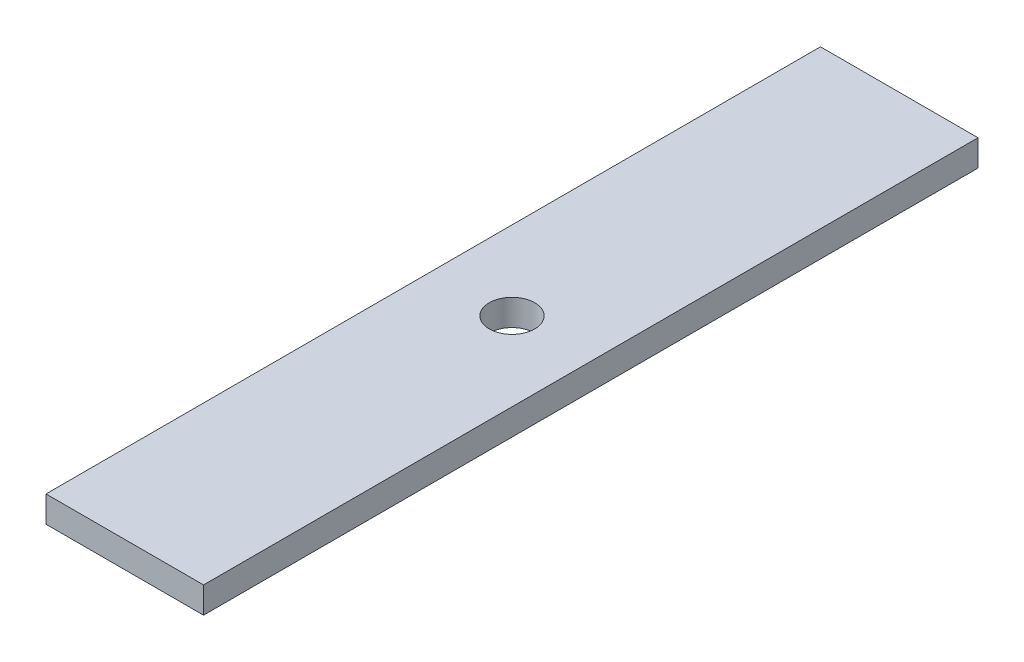
ISO-10303-21;
HEADER;
FILE_DESCRIPTION(('STEP AP214'),'2;1');
FILE_NAME('part.step','',(''),(''),'','','');
FILE_SCHEMA(('AUTOMOTIVE_DESIGN { 1 0 10303 214 1 1 1 1 }'));
ENDSEC;
DATA;
#1=APPLICATION_CONTEXT('core data for automotive mechanical design processes');
#2=APPLICATION_PROTOCOL_DEFINITION('international standard','automotive_design',2000,#1);
#3=PRODUCT_CONTEXT('',#1,'mechanical');
#4=PRODUCT('Part','Part','',(#3));
#5=PRODUCT_RELATED_PRODUCT_CATEGORY('part','',(#4));
#6=PRODUCT_DEFINITION_FORMATION('','',#4);
#7=PRODUCT_DEFINITION_CONTEXT('part definition',#1,'design');
#8=PRODUCT_DEFINITION('design','',#6,#7);
#9=PRODUCT_DEFINITION_SHAPE('','',#8);
#10=(LENGTH_UNIT() NAMED_UNIT(*) SI_UNIT(.MILLI.,.METRE.));
#11=(NAMED_UNIT(*) PLANE_ANGLE_UNIT() SI_UNIT($,.RADIAN.));
#12=(NAMED_UNIT(*) SI_UNIT($,.STERADIAN.) SOLID_ANGLE_UNIT());
#13=UNCERTAINTY_MEASURE_WITH_UNIT(LENGTH_MEASURE(1.E-05),#10,'distance_accuracy_value','');
#14=(GEOMETRIC_REPRESENTATION_CONTEXT(3) GLOBAL_UNCERTAINTY_ASSIGNED_CONTEXT((#13)) GLOBAL_UNIT_ASSIGNED_CONTEXT((#10,
#11,#12)) REPRESENTATION_CONTEXT('',''));
#15=CARTESIAN_POINT('',(0.,0.,0.));
#16=DIRECTION('',(0.,0.,1.));
#17=DIRECTION('',(1.,0.,0.));
#18=AXIS2_PLACEMENT_3D('',#15,#16,#17);
#19=CARTESIAN_POINT('',(9.52499999999999,-1.5875,93.65));
#20=DIRECTION('',(-1.,0.,0.));
#21=DIRECTION('',(0.,0.,1.));
#22=AXIS2_PLACEMENT_3D('',#19,#20,#21);
#23=PLANE('',#22);
#24=DIRECTION('',(0.,1.,0.));
#25=VECTOR('',#24,1.);
#26=CARTESIAN_POINT('',(9.52499999999999,-1.5875,0.));
#27=LINE('',#26,#25);
#28=CARTESIAN_POINT('',(9.52499999999999,-1.5875,0.));
#29=VERTEX_POINT('',#28);
#30=CARTESIAN_POINT('',(9.52499999999999,1.5875,0.));
#31=VERTEX_POINT('',#30);
#32=EDGE_CURVE('E98',#29,#31,#27,.T.);
#33=ORIENTED_EDGE('',*,*,#32,.T.);
#34=DIRECTION('',(0.,0.,-1.));
#35=VECTOR('',#34,1.);
#36=CARTESIAN_POINT('',(9.52499999999999,1.5875,93.65));
#37=LINE('',#36,#35);
#38=CARTESIAN_POINT('',(9.52499999999999,1.5875,93.65));
#39=VERTEX_POINT('',#38);
#40=EDGE_CURVE('E11',#39,#31,#37,.T.);
#41=ORIENTED_EDGE('',*,*,#40,.F.);
#42=DIRECTION('',(0.,1.,0.));
#43=VECTOR('',#42,1.);
#44=CARTESIAN_POINT('',(9.52499999999999,-1.5875,93.65));
#45=LINE('',#44,#43);
#46=CARTESIAN_POINT('',(9.52499999999999,-1.5875,93.65));
#47=VERTEX_POINT('',#46);
#48=EDGE_CURVE('E85',#47,#39,#45,.T.);
#49=ORIENTED_EDGE('',*,*,#48,.F.);
#50=DIRECTION('',(0.,0.,-1.));
#51=VECTOR('',#50,1.);
#52=CARTESIAN_POINT('',(9.52499999999999,-1.5875,93.65));
#53=LINE('',#52,#51);
#54=EDGE_CURVE('E94',#47,#29,#53,.T.);
#55=ORIENTED_EDGE('',*,*,#54,.T.);
#56=EDGE_LOOP('',(#33,#41,#49,#55));
#57=FACE_BOUND('',#56,.T.);
#58=ADVANCED_FACE('F33',(#57),#23,.F.);
#59=CARTESIAN_POINT('',(-9.52500000000001,1.5875,93.65));
#60=DIRECTION('',(0.,-1.,0.));
#61=DIRECTION('',(0.,0.,-1.));
#62=AXIS2_PLACEMENT_3D('',#59,#60,#61);
#63=PLANE('',#62);
#64=CARTESIAN_POINT('',(0.,1.5875,46.825));
#65=DIRECTION('',(0.,1.,0.));
#66=DIRECTION('',(0.,0.,1.));
#67=AXIS2_PLACEMENT_3D('',#64,#65,#66);
#68=CIRCLE('',#67,2.75);
#69=CARTESIAN_POINT('',(0.,1.5875,49.575));
#70=VERTEX_POINT('',#69);
#71=EDGE_CURVE('E111',#70,#70,#68,.T.);
#72=ORIENTED_EDGE('',*,*,#71,.F.);
#73=EDGE_LOOP('',(#72));
#74=FACE_BOUND('',#73,.T.);
#75=DIRECTION('',(-1.,0.,0.));
#76=VECTOR('',#75,1.);
#77=CARTESIAN_POINT('',(-9.52500000000001,1.5875,0.));
#78=LINE('',#77,#76);
#79=CARTESIAN_POINT('',(-9.52500000000001,1.5875,0.));
#80=VERTEX_POINT('',#79);
#81=EDGE_CURVE('E89',#31,#80,#78,.T.);
#82=ORIENTED_EDGE('',*,*,#81,.T.);
#83=DIRECTION('',(0.,0.,-1.));
#84=VECTOR('',#83,1.);
#85=CARTESIAN_POINT('',(-9.52500000000001,1.5875,93.65));
#86=LINE('',#85,#84);
#87=CARTESIAN_POINT('',(-9.52500000000001,1.5875,93.65));
#88=VERTEX_POINT('',#87);
#89=EDGE_CURVE('E42',#88,#80,#86,.T.);
#90=ORIENTED_EDGE('',*,*,#89,.F.);
#91=DIRECTION('',(-1.,0.,0.));
#92=VECTOR('',#91,1.);
#93=CARTESIAN_POINT('',(-9.52500000000001,1.5875,93.65));
#94=LINE('',#93,#92);
#95=EDGE_CURVE('E80',#39,#88,#94,.T.);
#96=ORIENTED_EDGE('',*,*,#95,.F.);
#97=ORIENTED_EDGE('',*,*,#40,.T.);
#98=EDGE_LOOP('',(#82,#90,#96,#97));
#99=FACE_BOUND('',#98,.T.);
#100=ADVANCED_FACE('F88',(#74,#99),#63,.F.);
#101=CARTESIAN_POINT('',(-9.52500000000001,-1.5875,93.65));
#102=DIRECTION('',(1.,0.,0.));
#103=DIRECTION('',(0.,0.,-1.));
#104=AXIS2_PLACEMENT_3D('',#101,#102,#103);
#105=PLANE('',#104);
#106=DIRECTION('',(0.,-1.,0.));
#107=VECTOR('',#106,1.);
#108=CARTESIAN_POINT('',(-9.52500000000001,-1.5875,0.));
#109=LINE('',#108,#107);
#110=CARTESIAN_POINT('',(-9.52500000000001,-1.5875,0.));
#111=VERTEX_POINT('',#110);
#112=EDGE_CURVE('E67',#80,#111,#109,.T.);
#113=ORIENTED_EDGE('',*,*,#112,.T.);
#114=DIRECTION('',(0.,0.,-1.));
#115=VECTOR('',#114,1.);
#116=CARTESIAN_POINT('',(-9.52500000000001,-1.5875,93.65));
#117=LINE('',#116,#115);
#118=CARTESIAN_POINT('',(-9.52500000000001,-1.5875,93.65));
#119=VERTEX_POINT('',#118);
#120=EDGE_CURVE('E90',#119,#111,#117,.T.);
#121=ORIENTED_EDGE('',*,*,#120,.F.);
#122=DIRECTION('',(0.,-1.,0.));
#123=VECTOR('',#122,1.);
#124=CARTESIAN_POINT('',(-9.52500000000001,-1.5875,93.65));
#125=LINE('',#124,#123);
#126=EDGE_CURVE('E83',#88,#119,#125,.T.);
#127=ORIENTED_EDGE('',*,*,#126,.F.);
#128=ORIENTED_EDGE('',*,*,#89,.T.);
#129=EDGE_LOOP('',(#113,#121,#127,#128));
#130=FACE_BOUND('',#129,.T.);
#131=ADVANCED_FACE('F92',(#130),#105,.F.);
#132=CARTESIAN_POINT('',(-9.52500000000001,-1.5875,93.65));
#133=DIRECTION('',(0.,1.,0.));
#134=DIRECTION('',(0.,0.,1.));
#135=AXIS2_PLACEMENT_3D('',#132,#133,#134);
#136=PLANE('',#135);
#137=CARTESIAN_POINT('',(0.,-1.5875,46.825));
#138=DIRECTION('',(0.,1.,0.));
#139=DIRECTION('',(0.,0.,1.));
#140=AXIS2_PLACEMENT_3D('',#137,#138,#139);
#141=CIRCLE('',#140,2.75);
#142=CARTESIAN_POINT('',(0.,-1.5875,49.575));
#143=VERTEX_POINT('',#142);
#144=EDGE_CURVE('E36',#143,#143,#141,.T.);
#145=ORIENTED_EDGE('',*,*,#144,.T.);
#146=EDGE_LOOP('',(#145));
#147=FACE_BOUND('',#146,.T.);
#148=DIRECTION('',(1.,0.,0.));
#149=VECTOR('',#148,1.);
#150=CARTESIAN_POINT('',(-9.52500000000001,-1.5875,0.));
#151=LINE('',#150,#149);
#152=EDGE_CURVE('E73',#111,#29,#151,.T.);
#153=ORIENTED_EDGE('',*,*,#152,.T.);
#154=ORIENTED_EDGE('',*,*,#54,.F.);
#155=DIRECTION('',(1.,0.,0.));
#156=VECTOR('',#155,1.);
#157=CARTESIAN_POINT('',(-9.52500000000001,-1.5875,93.65));
#158=LINE('',#157,#156);
#159=EDGE_CURVE('E50',#119,#47,#158,.T.);
#160=ORIENTED_EDGE('',*,*,#159,.F.);
#161=ORIENTED_EDGE('',*,*,#120,.T.);
#162=EDGE_LOOP('',(#153,#154,#160,#161));
#163=FACE_BOUND('',#162,.T.);
#164=ADVANCED_FACE('F105',(#147,#163),#136,.F.);
#165=CARTESIAN_POINT('',(0.,0.,93.65));
#166=DIRECTION('',(0.,0.,-1.));
#167=DIRECTION('',(-1.,0.,0.));
#168=AXIS2_PLACEMENT_3D('',#165,#166,#167);
#169=PLANE('',#168);
#170=ORIENTED_EDGE('',*,*,#48,.T.);
#171=ORIENTED_EDGE('',*,*,#95,.T.);
#172=ORIENTED_EDGE('',*,*,#126,.T.);
#173=ORIENTED_EDGE('',*,*,#159,.T.);
#174=EDGE_LOOP('',(#170,#171,#172,#173));
#175=FACE_BOUND('',#174,.T.);
#176=ADVANCED_FACE('F81',(#175),#169,.F.);
#177=CARTESIAN_POINT('',(0.,0.,0.));
#178=DIRECTION('',(0.,0.,-1.));
#179=DIRECTION('',(-1.,0.,0.));
#180=AXIS2_PLACEMENT_3D('',#177,#178,#179);
#181=PLANE('',#180);
#182=ORIENTED_EDGE('',*,*,#32,.F.);
#183=ORIENTED_EDGE('',*,*,#152,.F.);
#184=ORIENTED_EDGE('',*,*,#112,.F.);
#185=ORIENTED_EDGE('',*,*,#81,.F.);
#186=EDGE_LOOP('',(#182,#183,#184,#185));
#187=FACE_BOUND('',#186,.T.);
#188=ADVANCED_FACE('F108',(#187),#181,.T.);
#189=CARTESIAN_POINT('',(0.,-8.4125,46.825));
#190=DIRECTION('',(0.,1.,0.));
#191=DIRECTION('',(0.,0.,1.));
#192=AXIS2_PLACEMENT_3D('',#189,#190,#191);
#193=CYLINDRICAL_SURFACE('',#192,2.75);
#194=ORIENTED_EDGE('',*,*,#71,.T.);
#195=EDGE_LOOP('',(#194));
#196=FACE_BOUND('',#195,.T.);
#197=ORIENTED_EDGE('',*,*,#144,.F.);
#198=EDGE_LOOP('',(#197));
#199=FACE_BOUND('',#198,.T.);
#200=ADVANCED_FACE('F119',(#196,#199),#193,.F.);
#201=CLOSED_SHELL('',(#58,#100,#131,#164,#176,#188,#200));
#202=MANIFOLD_SOLID_BREP('B2',#201);
#203=ADVANCED_BREP_SHAPE_REPRESENTATION('',(#18,#202),#14);
#204=SHAPE_DEFINITION_REPRESENTATION(#9,#203);
ENDSEC;
END-ISO-10303-21;
